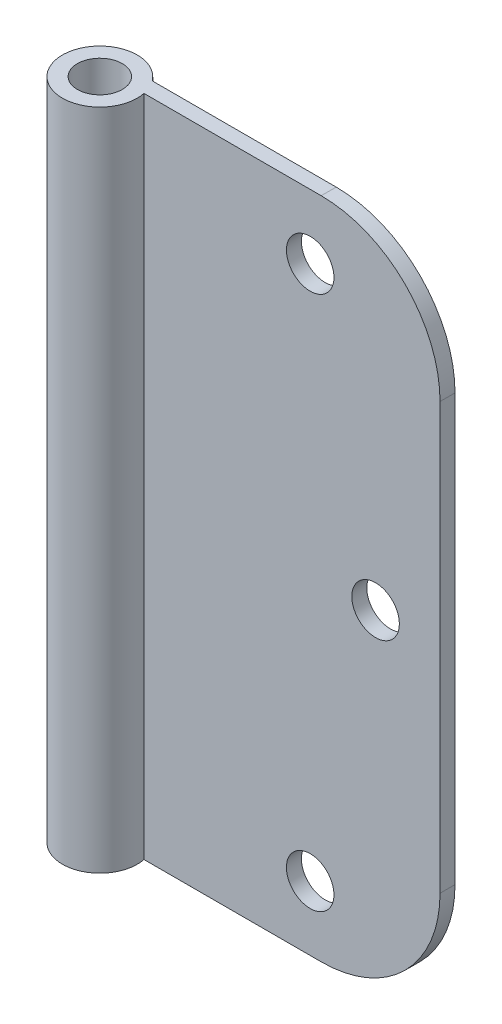
ISO-10303-21;
HEADER;
FILE_DESCRIPTION(('STEP AP214'),'2;1');
FILE_NAME('part.step','',(''),(''),'','','');
FILE_SCHEMA(('AUTOMOTIVE_DESIGN { 1 0 10303 214 1 1 1 1 }'));
ENDSEC;
DATA;
#1=APPLICATION_CONTEXT('core data for automotive mechanical design processes');
#2=APPLICATION_PROTOCOL_DEFINITION('international standard','automotive_design',2000,#1);
#3=PRODUCT_CONTEXT('',#1,'mechanical');
#4=PRODUCT('Part','Part','',(#3));
#5=PRODUCT_RELATED_PRODUCT_CATEGORY('part','',(#4));
#6=PRODUCT_DEFINITION_FORMATION('','',#4);
#7=PRODUCT_DEFINITION_CONTEXT('part definition',#1,'design');
#8=PRODUCT_DEFINITION('design','',#6,#7);
#9=PRODUCT_DEFINITION_SHAPE('','',#8);
#10=(LENGTH_UNIT() NAMED_UNIT(*) SI_UNIT(.MILLI.,.METRE.));
#11=(NAMED_UNIT(*) PLANE_ANGLE_UNIT() SI_UNIT($,.RADIAN.));
#12=(NAMED_UNIT(*) SI_UNIT($,.STERADIAN.) SOLID_ANGLE_UNIT());
#13=UNCERTAINTY_MEASURE_WITH_UNIT(LENGTH_MEASURE(1.E-05),#10,'distance_accuracy_value','');
#14=(GEOMETRIC_REPRESENTATION_CONTEXT(3) GLOBAL_UNCERTAINTY_ASSIGNED_CONTEXT((#13)) GLOBAL_UNIT_ASSIGNED_CONTEXT((#10,
#11,#12)) REPRESENTATION_CONTEXT('',''));
#15=CARTESIAN_POINT('',(0.,0.,0.));
#16=DIRECTION('',(0.,0.,1.));
#17=DIRECTION('',(1.,0.,0.));
#18=AXIS2_PLACEMENT_3D('',#15,#16,#17);
#19=CARTESIAN_POINT('',(0.,0.,2.));
#20=DIRECTION('',(0.,0.,1.));
#21=DIRECTION('',(1.,0.,0.));
#22=AXIS2_PLACEMENT_3D('',#19,#20,#21);
#23=PLANE('',#22);
#24=CARTESIAN_POINT('',(71.5518000000005,-8.61,2.));
#25=DIRECTION('',(0.,0.,1.));
#26=DIRECTION('',(1.,0.,0.));
#27=AXIS2_PLACEMENT_3D('',#24,#25,#26);
#28=CIRCLE('',#27,3.175);
#29=CARTESIAN_POINT('',(74.7268000000005,-8.61,2.));
#30=VERTEX_POINT('',#29);
#31=EDGE_CURVE('E129',#30,#30,#28,.T.);
#32=ORIENTED_EDGE('',*,*,#31,.F.);
#33=EDGE_LOOP('',(#32));
#34=FACE_BOUND('',#33,.T.);
#35=DIRECTION('',(1.,0.,0.));
#36=VECTOR('',#35,1.);
#37=CARTESIAN_POINT('',(49.45,-88.646,2.));
#38=LINE('',#37,#36);
#39=CARTESIAN_POINT('',(49.3489794855664,-88.646,2.));
#40=VERTEX_POINT('',#39);
#41=CARTESIAN_POINT('',(73.025,-88.646,2.));
#42=VERTEX_POINT('',#41);
#43=EDGE_CURVE('E144',#40,#42,#38,.T.);
#44=ORIENTED_EDGE('',*,*,#43,.T.);
#45=CARTESIAN_POINT('',(73.025,-72.771,2.));
#46=DIRECTION('',(0.,0.,1.));
#47=DIRECTION('',(1.,0.,0.));
#48=AXIS2_PLACEMENT_3D('',#45,#46,#47);
#49=CIRCLE('',#48,15.875);
#50=CARTESIAN_POINT('',(88.9,-72.771,2.));
#51=VERTEX_POINT('',#50);
#52=EDGE_CURVE('E40',#42,#51,#49,.T.);
#53=ORIENTED_EDGE('',*,*,#52,.T.);
#54=DIRECTION('',(0.,1.,0.));
#55=VECTOR('',#54,1.);
#56=CARTESIAN_POINT('',(88.9,0.,2.));
#57=LINE('',#56,#55);
#58=CARTESIAN_POINT('',(88.9,-15.875,2.));
#59=VERTEX_POINT('',#58);
#60=EDGE_CURVE('E140',#51,#59,#57,.T.);
#61=ORIENTED_EDGE('',*,*,#60,.T.);
#62=CARTESIAN_POINT('',(73.025,-15.875,2.));
#63=DIRECTION('',(0.,0.,1.));
#64=DIRECTION('',(1.,0.,0.));
#65=AXIS2_PLACEMENT_3D('',#62,#63,#64);
#66=CIRCLE('',#65,15.875);
#67=CARTESIAN_POINT('',(73.025,0.,2.));
#68=VERTEX_POINT('',#67);
#69=EDGE_CURVE('E47',#59,#68,#66,.T.);
#70=ORIENTED_EDGE('',*,*,#69,.T.);
#71=DIRECTION('',(-1.,0.,0.));
#72=VECTOR('',#71,1.);
#73=CARTESIAN_POINT('',(49.45,0.,2.));
#74=LINE('',#73,#72);
#75=CARTESIAN_POINT('',(49.3489794855664,0.,2.));
#76=VERTEX_POINT('',#75);
#77=EDGE_CURVE('E142',#68,#76,#74,.T.);
#78=ORIENTED_EDGE('',*,*,#77,.T.);
#79=DIRECTION('',(0.,1.,0.));
#80=VECTOR('',#79,1.);
#81=CARTESIAN_POINT('',(49.3489794855664,-102.788135623731,2.));
#82=LINE('',#81,#80);
#83=EDGE_CURVE('E106',#40,#76,#82,.T.);
#84=ORIENTED_EDGE('',*,*,#83,.F.);
#85=EDGE_LOOP('',(#44,#53,#61,#70,#78,#84));
#86=FACE_BOUND('',#85,.T.);
#87=CARTESIAN_POINT('',(80.2894000000005,-44.323,2.));
#88=DIRECTION('',(0.,0.,1.));
#89=DIRECTION('',(1.,0.,0.));
#90=AXIS2_PLACEMENT_3D('',#87,#88,#89);
#91=CIRCLE('',#90,3.175);
#92=CARTESIAN_POINT('',(83.4644000000005,-44.323,2.));
#93=VERTEX_POINT('',#92);
#94=EDGE_CURVE('E135',#93,#93,#91,.T.);
#95=ORIENTED_EDGE('',*,*,#94,.F.);
#96=EDGE_LOOP('',(#95));
#97=FACE_BOUND('',#96,.T.);
#98=CARTESIAN_POINT('',(71.5518000000005,-80.036,2.));
#99=DIRECTION('',(0.,0.,1.));
#100=DIRECTION('',(-1.,0.,0.));
#101=AXIS2_PLACEMENT_3D('',#98,#99,#100);
#102=CIRCLE('',#101,3.17499999999998);
#103=CARTESIAN_POINT('',(68.3768000000005,-80.036,2.));
#104=VERTEX_POINT('',#103);
#105=EDGE_CURVE('E123',#104,#104,#102,.T.);
#106=ORIENTED_EDGE('',*,*,#105,.F.);
#107=EDGE_LOOP('',(#106));
#108=FACE_BOUND('',#107,.T.);
#109=ADVANCED_FACE('F32',(#34,#86,#97,#108),#23,.T.);
#110=CARTESIAN_POINT('',(0.,0.,0.));
#111=DIRECTION('',(0.,0.,1.));
#112=DIRECTION('',(1.,0.,0.));
#113=AXIS2_PLACEMENT_3D('',#110,#111,#112);
#114=PLANE('',#113);
#115=DIRECTION('',(0.,1.,0.));
#116=VECTOR('',#115,1.);
#117=CARTESIAN_POINT('',(88.9,0.,0.));
#118=LINE('',#117,#116);
#119=CARTESIAN_POINT('',(88.9,-72.771,0.));
#120=VERTEX_POINT('',#119);
#121=CARTESIAN_POINT('',(88.9,-15.875,0.));
#122=VERTEX_POINT('',#121);
#123=EDGE_CURVE('E96',#120,#122,#118,.T.);
#124=ORIENTED_EDGE('',*,*,#123,.F.);
#125=CARTESIAN_POINT('',(73.025,-72.771,0.));
#126=DIRECTION('',(0.,0.,1.));
#127=DIRECTION('',(1.,0.,0.));
#128=AXIS2_PLACEMENT_3D('',#125,#126,#127);
#129=CIRCLE('',#128,15.875);
#130=CARTESIAN_POINT('',(73.025,-88.646,0.));
#131=VERTEX_POINT('',#130);
#132=EDGE_CURVE('E156',#120,#131,#129,.F.);
#133=ORIENTED_EDGE('',*,*,#132,.T.);
#134=DIRECTION('',(1.,0.,0.));
#135=VECTOR('',#134,1.);
#136=CARTESIAN_POINT('',(49.45,-88.646,0.));
#137=LINE('',#136,#135);
#138=CARTESIAN_POINT('',(48.45,-88.646,0.));
#139=VERTEX_POINT('',#138);
#140=EDGE_CURVE('E95',#139,#131,#137,.T.);
#141=ORIENTED_EDGE('',*,*,#140,.F.);
#142=DIRECTION('',(0.,1.,0.));
#143=VECTOR('',#142,1.);
#144=CARTESIAN_POINT('',(48.45,-102.788135623731,0.));
#145=LINE('',#144,#143);
#146=CARTESIAN_POINT('',(48.45,0.,0.));
#147=VERTEX_POINT('',#146);
#148=EDGE_CURVE('E99',#139,#147,#145,.T.);
#149=ORIENTED_EDGE('',*,*,#148,.T.);
#150=DIRECTION('',(-1.,0.,0.));
#151=VECTOR('',#150,1.);
#152=CARTESIAN_POINT('',(49.45,0.,0.));
#153=LINE('',#152,#151);
#154=CARTESIAN_POINT('',(73.025,0.,0.));
#155=VERTEX_POINT('',#154);
#156=EDGE_CURVE('E87',#155,#147,#153,.T.);
#157=ORIENTED_EDGE('',*,*,#156,.F.);
#158=CARTESIAN_POINT('',(73.025,-15.875,0.));
#159=DIRECTION('',(0.,0.,1.));
#160=DIRECTION('',(1.,0.,0.));
#161=AXIS2_PLACEMENT_3D('',#158,#159,#160);
#162=CIRCLE('',#161,15.875);
#163=EDGE_CURVE('E154',#155,#122,#162,.F.);
#164=ORIENTED_EDGE('',*,*,#163,.T.);
#165=EDGE_LOOP('',(#124,#133,#141,#149,#157,#164));
#166=FACE_BOUND('',#165,.T.);
#167=CARTESIAN_POINT('',(80.2894000000005,-44.323,0.));
#168=DIRECTION('',(0.,0.,1.));
#169=DIRECTION('',(1.,0.,0.));
#170=AXIS2_PLACEMENT_3D('',#167,#168,#169);
#171=CIRCLE('',#170,3.175);
#172=CARTESIAN_POINT('',(83.4644000000005,-44.323,0.));
#173=VERTEX_POINT('',#172);
#174=EDGE_CURVE('E132',#173,#173,#171,.T.);
#175=ORIENTED_EDGE('',*,*,#174,.T.);
#176=EDGE_LOOP('',(#175));
#177=FACE_BOUND('',#176,.T.);
#178=CARTESIAN_POINT('',(71.5518000000005,-8.61,0.));
#179=DIRECTION('',(0.,0.,1.));
#180=DIRECTION('',(1.,0.,0.));
#181=AXIS2_PLACEMENT_3D('',#178,#179,#180);
#182=CIRCLE('',#181,3.175);
#183=CARTESIAN_POINT('',(74.7268000000005,-8.61,0.));
#184=VERTEX_POINT('',#183);
#185=EDGE_CURVE('E126',#184,#184,#182,.T.);
#186=ORIENTED_EDGE('',*,*,#185,.T.);
#187=EDGE_LOOP('',(#186));
#188=FACE_BOUND('',#187,.T.);
#189=CARTESIAN_POINT('',(71.5518000000005,-80.036,0.));
#190=DIRECTION('',(0.,0.,1.));
#191=DIRECTION('',(-1.,0.,0.));
#192=AXIS2_PLACEMENT_3D('',#189,#190,#191);
#193=CIRCLE('',#192,3.17499999999998);
#194=CARTESIAN_POINT('',(68.3768000000005,-80.036,0.));
#195=VERTEX_POINT('',#194);
#196=EDGE_CURVE('E122',#195,#195,#193,.T.);
#197=ORIENTED_EDGE('',*,*,#196,.T.);
#198=EDGE_LOOP('',(#197));
#199=FACE_BOUND('',#198,.T.);
#200=ADVANCED_FACE('F101',(#166,#177,#188,#199),#114,.F.);
#201=CARTESIAN_POINT('',(88.9,0.,2.));
#202=DIRECTION('',(-1.,0.,0.));
#203=DIRECTION('',(0.,0.,1.));
#204=AXIS2_PLACEMENT_3D('',#201,#202,#203);
#205=PLANE('',#204);
#206=ORIENTED_EDGE('',*,*,#60,.F.);
#207=DIRECTION('',(0.,0.,-1.));
#208=VECTOR('',#207,1.);
#209=CARTESIAN_POINT('',(88.9,-72.771,2.));
#210=LINE('',#209,#208);
#211=EDGE_CURVE('E151',#51,#120,#210,.T.);
#212=ORIENTED_EDGE('',*,*,#211,.T.);
#213=ORIENTED_EDGE('',*,*,#123,.T.);
#214=DIRECTION('',(0.,0.,-1.));
#215=VECTOR('',#214,1.);
#216=CARTESIAN_POINT('',(88.9,-15.875,2.));
#217=LINE('',#216,#215);
#218=EDGE_CURVE('E146',#122,#59,#217,.F.);
#219=ORIENTED_EDGE('',*,*,#218,.T.);
#220=EDGE_LOOP('',(#206,#212,#213,#219));
#221=FACE_BOUND('',#220,.T.);
#222=ADVANCED_FACE('F165',(#221),#205,.F.);
#223=CARTESIAN_POINT('',(49.45,0.,2.));
#224=DIRECTION('',(0.,-1.,0.));
#225=DIRECTION('',(1.,0.,0.));
#226=AXIS2_PLACEMENT_3D('',#223,#224,#225);
#227=PLANE('',#226);
#228=ORIENTED_EDGE('',*,*,#77,.F.);
#229=DIRECTION('',(0.,0.,-1.));
#230=VECTOR('',#229,1.);
#231=CARTESIAN_POINT('',(73.025,0.,2.));
#232=LINE('',#231,#230);
#233=EDGE_CURVE('E11',#68,#155,#232,.T.);
#234=ORIENTED_EDGE('',*,*,#233,.T.);
#235=ORIENTED_EDGE('',*,*,#156,.T.);
#236=CARTESIAN_POINT('',(44.45,0.,3.));
#237=DIRECTION('',(0.,1.,0.));
#238=DIRECTION('',(-1.,0.,0.));
#239=AXIS2_PLACEMENT_3D('',#236,#237,#238);
#240=CIRCLE('',#239,5.);
#241=EDGE_CURVE('E92',#147,#76,#240,.T.);
#242=ORIENTED_EDGE('',*,*,#241,.T.);
#243=EDGE_LOOP('',(#228,#234,#235,#242));
#244=FACE_BOUND('',#243,.T.);
#245=CARTESIAN_POINT('',(44.45,0.,3.));
#246=DIRECTION('',(0.,1.,0.));
#247=DIRECTION('',(-1.,0.,0.));
#248=AXIS2_PLACEMENT_3D('',#245,#246,#247);
#249=CIRCLE('',#248,3.);
#250=CARTESIAN_POINT('',(41.45,0.,3.));
#251=VERTEX_POINT('',#250);
#252=EDGE_CURVE('E111',#251,#251,#249,.T.);
#253=ORIENTED_EDGE('',*,*,#252,.F.);
#254=EDGE_LOOP('',(#253));
#255=FACE_BOUND('',#254,.T.);
#256=ADVANCED_FACE('F89',(#244,#255),#227,.F.);
#257=CARTESIAN_POINT('',(49.45,-88.646,2.));
#258=DIRECTION('',(0.,1.,0.));
#259=DIRECTION('',(0.,0.,1.));
#260=AXIS2_PLACEMENT_3D('',#257,#258,#259);
#261=PLANE('',#260);
#262=ORIENTED_EDGE('',*,*,#140,.T.);
#263=DIRECTION('',(0.,0.,-1.));
#264=VECTOR('',#263,1.);
#265=CARTESIAN_POINT('',(73.025,-88.646,2.));
#266=LINE('',#265,#264);
#267=EDGE_CURVE('E55',#131,#42,#266,.F.);
#268=ORIENTED_EDGE('',*,*,#267,.T.);
#269=ORIENTED_EDGE('',*,*,#43,.F.);
#270=CARTESIAN_POINT('',(44.45,-88.646,3.));
#271=DIRECTION('',(0.,1.,0.));
#272=DIRECTION('',(0.,0.,1.));
#273=AXIS2_PLACEMENT_3D('',#270,#271,#272);
#274=CIRCLE('',#273,5.);
#275=EDGE_CURVE('E117',#40,#139,#274,.F.);
#276=ORIENTED_EDGE('',*,*,#275,.T.);
#277=EDGE_LOOP('',(#262,#268,#269,#276));
#278=FACE_BOUND('',#277,.T.);
#279=CARTESIAN_POINT('',(44.45,-88.646,3.));
#280=DIRECTION('',(0.,1.,0.));
#281=DIRECTION('',(0.,0.,1.));
#282=AXIS2_PLACEMENT_3D('',#279,#280,#281);
#283=CIRCLE('',#282,3.);
#284=CARTESIAN_POINT('',(44.45,-88.646,6.));
#285=VERTEX_POINT('',#284);
#286=EDGE_CURVE('E119',#285,#285,#283,.F.);
#287=ORIENTED_EDGE('',*,*,#286,.F.);
#288=EDGE_LOOP('',(#287));
#289=FACE_BOUND('',#288,.T.);
#290=ADVANCED_FACE('F168',(#278,#289),#261,.F.);
#291=CARTESIAN_POINT('',(80.2894000000005,-44.323,2.));
#292=DIRECTION('',(0.,0.,-1.));
#293=DIRECTION('',(-1.,0.,0.));
#294=AXIS2_PLACEMENT_3D('',#291,#292,#293);
#295=CYLINDRICAL_SURFACE('',#294,3.175);
#296=ORIENTED_EDGE('',*,*,#94,.T.);
#297=EDGE_LOOP('',(#296));
#298=FACE_BOUND('',#297,.T.);
#299=ORIENTED_EDGE('',*,*,#174,.F.);
#300=EDGE_LOOP('',(#299));
#301=FACE_BOUND('',#300,.T.);
#302=ADVANCED_FACE('F188',(#298,#301),#295,.F.);
#303=CARTESIAN_POINT('',(71.5518000000005,-8.61,2.));
#304=DIRECTION('',(0.,0.,-1.));
#305=DIRECTION('',(-1.,0.,0.));
#306=AXIS2_PLACEMENT_3D('',#303,#304,#305);
#307=CYLINDRICAL_SURFACE('',#306,3.175);
#308=ORIENTED_EDGE('',*,*,#31,.T.);
#309=EDGE_LOOP('',(#308));
#310=FACE_BOUND('',#309,.T.);
#311=ORIENTED_EDGE('',*,*,#185,.F.);
#312=EDGE_LOOP('',(#311));
#313=FACE_BOUND('',#312,.T.);
#314=ADVANCED_FACE('F217',(#310,#313),#307,.F.);
#315=CARTESIAN_POINT('',(71.5518000000005,-80.036,2.));
#316=DIRECTION('',(0.,0.,-1.));
#317=DIRECTION('',(-1.,0.,0.));
#318=AXIS2_PLACEMENT_3D('',#315,#316,#317);
#319=CYLINDRICAL_SURFACE('',#318,3.17499999999998);
#320=ORIENTED_EDGE('',*,*,#105,.T.);
#321=EDGE_LOOP('',(#320));
#322=FACE_BOUND('',#321,.T.);
#323=ORIENTED_EDGE('',*,*,#196,.F.);
#324=EDGE_LOOP('',(#323));
#325=FACE_BOUND('',#324,.T.);
#326=ADVANCED_FACE('F178',(#322,#325),#319,.F.);
#327=CARTESIAN_POINT('',(73.025,-72.771,2.));
#328=DIRECTION('',(0.,0.,-1.));
#329=DIRECTION('',(-1.,0.,0.));
#330=AXIS2_PLACEMENT_3D('',#327,#328,#329);
#331=CYLINDRICAL_SURFACE('',#330,15.875);
#332=ORIENTED_EDGE('',*,*,#52,.F.);
#333=ORIENTED_EDGE('',*,*,#267,.F.);
#334=ORIENTED_EDGE('',*,*,#132,.F.);
#335=ORIENTED_EDGE('',*,*,#211,.F.);
#336=EDGE_LOOP('',(#332,#333,#334,#335));
#337=FACE_BOUND('',#336,.T.);
#338=ADVANCED_FACE('F167',(#337),#331,.T.);
#339=CARTESIAN_POINT('',(73.025,-15.875,2.));
#340=DIRECTION('',(0.,0.,-1.));
#341=DIRECTION('',(-1.,0.,0.));
#342=AXIS2_PLACEMENT_3D('',#339,#340,#341);
#343=CYLINDRICAL_SURFACE('',#342,15.875);
#344=ORIENTED_EDGE('',*,*,#69,.F.);
#345=ORIENTED_EDGE('',*,*,#218,.F.);
#346=ORIENTED_EDGE('',*,*,#163,.F.);
#347=ORIENTED_EDGE('',*,*,#233,.F.);
#348=EDGE_LOOP('',(#344,#345,#346,#347));
#349=FACE_BOUND('',#348,.T.);
#350=ADVANCED_FACE('F34',(#349),#343,.T.);
#351=CARTESIAN_POINT('',(44.45,-102.788135623731,3.));
#352=DIRECTION('',(0.,1.,0.));
#353=DIRECTION('',(-1.,0.,0.));
#354=AXIS2_PLACEMENT_3D('',#351,#352,#353);
#355=CYLINDRICAL_SURFACE('',#354,5.);
#356=ORIENTED_EDGE('',*,*,#275,.F.);
#357=ORIENTED_EDGE('',*,*,#83,.T.);
#358=ORIENTED_EDGE('',*,*,#241,.F.);
#359=ORIENTED_EDGE('',*,*,#148,.F.);
#360=EDGE_LOOP('',(#356,#357,#358,#359));
#361=FACE_BOUND('',#360,.T.);
#362=ADVANCED_FACE('F109',(#361),#355,.T.);
#363=CARTESIAN_POINT('',(44.45,-102.788135623731,3.));
#364=DIRECTION('',(0.,1.,0.));
#365=DIRECTION('',(-1.,0.,0.));
#366=AXIS2_PLACEMENT_3D('',#363,#364,#365);
#367=CYLINDRICAL_SURFACE('',#366,3.);
#368=ORIENTED_EDGE('',*,*,#286,.T.);
#369=EDGE_LOOP('',(#368));
#370=FACE_BOUND('',#369,.T.);
#371=ORIENTED_EDGE('',*,*,#252,.T.);
#372=EDGE_LOOP('',(#371));
#373=FACE_BOUND('',#372,.T.);
#374=ADVANCED_FACE('F176',(#370,#373),#367,.F.);
#375=CLOSED_SHELL('',(#109,#200,#222,#256,#290,#302,#314,#326,#338,#350,#362,#374));
#376=MANIFOLD_SOLID_BREP('B2',#375);
#377=ADVANCED_BREP_SHAPE_REPRESENTATION('',(#18,#376),#14);
#378=SHAPE_DEFINITION_REPRESENTATION(#9,#377);
ENDSEC;
END-ISO-10303-21;
